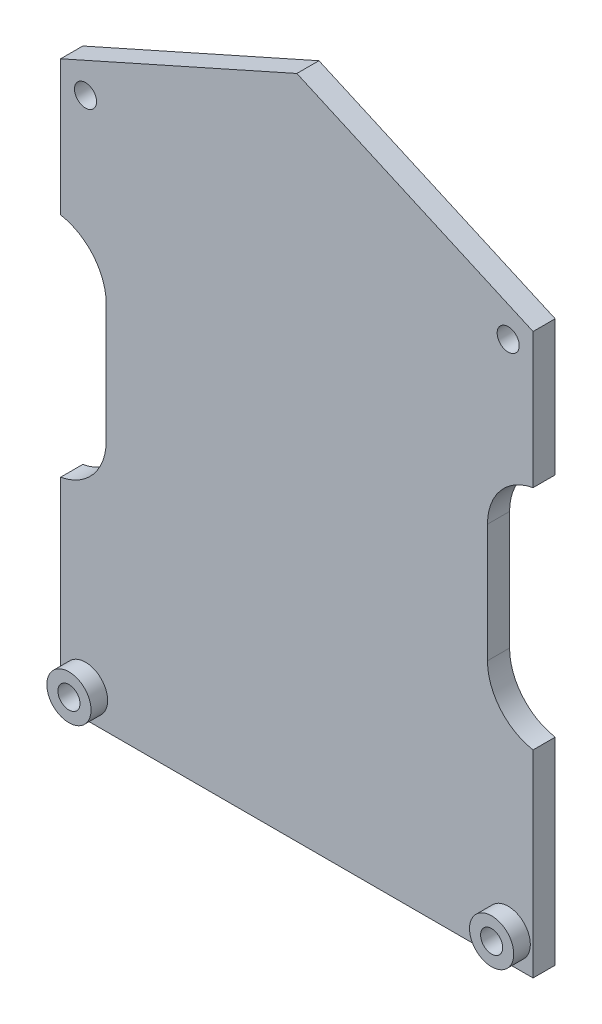
ISO-10303-21;
HEADER;
FILE_DESCRIPTION(('STEP AP214'),'2;1');
FILE_NAME('part.step','',(''),(''),'','','');
FILE_SCHEMA(('AUTOMOTIVE_DESIGN { 1 0 10303 214 1 1 1 1 }'));
ENDSEC;
DATA;
#1=APPLICATION_CONTEXT('core data for automotive mechanical design processes');
#2=APPLICATION_PROTOCOL_DEFINITION('international standard','automotive_design',2000,#1);
#3=PRODUCT_CONTEXT('',#1,'mechanical');
#4=PRODUCT('Part','Part','',(#3));
#5=PRODUCT_RELATED_PRODUCT_CATEGORY('part','',(#4));
#6=PRODUCT_DEFINITION_FORMATION('','',#4);
#7=PRODUCT_DEFINITION_CONTEXT('part definition',#1,'design');
#8=PRODUCT_DEFINITION('design','',#6,#7);
#9=PRODUCT_DEFINITION_SHAPE('','',#8);
#10=(LENGTH_UNIT() NAMED_UNIT(*) SI_UNIT(.MILLI.,.METRE.));
#11=(NAMED_UNIT(*) PLANE_ANGLE_UNIT() SI_UNIT($,.RADIAN.));
#12=(NAMED_UNIT(*) SI_UNIT($,.STERADIAN.) SOLID_ANGLE_UNIT());
#13=UNCERTAINTY_MEASURE_WITH_UNIT(LENGTH_MEASURE(1.E-05),#10,'distance_accuracy_value','');
#14=(GEOMETRIC_REPRESENTATION_CONTEXT(3) GLOBAL_UNCERTAINTY_ASSIGNED_CONTEXT((#13)) GLOBAL_UNIT_ASSIGNED_CONTEXT((#10,
#11,#12)) REPRESENTATION_CONTEXT('',''));
#15=CARTESIAN_POINT('',(0.,0.,0.));
#16=DIRECTION('',(0.,0.,1.));
#17=DIRECTION('',(1.,0.,0.));
#18=AXIS2_PLACEMENT_3D('',#15,#16,#17);
#19=CARTESIAN_POINT('',(0.,0.,4.));
#20=DIRECTION('',(0.,0.,-1.));
#21=DIRECTION('',(-1.,0.,0.));
#22=AXIS2_PLACEMENT_3D('',#19,#20,#21);
#23=PLANE('',#22);
#24=CARTESIAN_POINT('',(38.25,-87.85,4.));
#25=DIRECTION('',(0.,0.,-1.));
#26=DIRECTION('',(-1.,0.,0.));
#27=AXIS2_PLACEMENT_3D('',#24,#25,#26);
#28=CIRCLE('',#27,4.);
#29=CARTESIAN_POINT('',(34.25,-87.85,4.));
#30=VERTEX_POINT('',#29);
#31=EDGE_CURVE('E41',#30,#30,#28,.F.);
#32=ORIENTED_EDGE('',*,*,#31,.F.);
#33=EDGE_LOOP('',(#32));
#34=FACE_BOUND('',#33,.T.);
#35=DIRECTION('',(-0.913250682606187,-0.407398074025065,0.));
#36=VECTOR('',#35,1.);
#37=CARTESIAN_POINT('',(-42.75,8.48208122180861,4.));
#38=LINE('',#37,#36);
#39=CARTESIAN_POINT('',(0.,27.5527131920688,4.));
#40=VERTEX_POINT('',#39);
#41=CARTESIAN_POINT('',(-42.75,8.48208122180861,4.));
#42=VERTEX_POINT('',#41);
#43=EDGE_CURVE('E139',#40,#42,#38,.T.);
#44=ORIENTED_EDGE('',*,*,#43,.T.);
#45=DIRECTION('',(0.,-1.,0.));
#46=VECTOR('',#45,1.);
#47=CARTESIAN_POINT('',(-42.75,8.48208122180861,4.));
#48=LINE('',#47,#46);
#49=CARTESIAN_POINT('',(-42.75,-16.,4.));
#50=VERTEX_POINT('',#49);
#51=EDGE_CURVE('E129',#42,#50,#48,.T.);
#52=ORIENTED_EDGE('',*,*,#51,.T.);
#53=CARTESIAN_POINT('',(-44.5,-25.8456843337576,4.));
#54=DIRECTION('',(0.,0.,-1.));
#55=DIRECTION('',(-1.,0.,0.));
#56=AXIS2_PLACEMENT_3D('',#53,#54,#55);
#57=CIRCLE('',#56,10.);
#58=CARTESIAN_POINT('',(-34.5,-25.8456843337576,4.));
#59=VERTEX_POINT('',#58);
#60=EDGE_CURVE('E55',#50,#59,#57,.T.);
#61=ORIENTED_EDGE('',*,*,#60,.T.);
#62=DIRECTION('',(0.,-1.,0.));
#63=VECTOR('',#62,1.);
#64=CARTESIAN_POINT('',(-34.5,-16.,4.));
#65=LINE('',#64,#63);
#66=CARTESIAN_POINT('',(-34.5,-47.2543156662424,4.));
#67=VERTEX_POINT('',#66);
#68=EDGE_CURVE('E138',#59,#67,#65,.T.);
#69=ORIENTED_EDGE('',*,*,#68,.T.);
#70=CARTESIAN_POINT('',(-44.5,-47.2543156662424,4.));
#71=DIRECTION('',(0.,0.,-1.));
#72=DIRECTION('',(-1.,0.,0.));
#73=AXIS2_PLACEMENT_3D('',#70,#71,#72);
#74=CIRCLE('',#73,10.);
#75=CARTESIAN_POINT('',(-42.75,-57.1,4.));
#76=VERTEX_POINT('',#75);
#77=EDGE_CURVE('E177',#67,#76,#74,.T.);
#78=ORIENTED_EDGE('',*,*,#77,.T.);
#79=DIRECTION('',(0.,-1.,0.));
#80=VECTOR('',#79,1.);
#81=CARTESIAN_POINT('',(-42.75,-57.1,4.));
#82=LINE('',#81,#80);
#83=CARTESIAN_POINT('',(-42.75,-92.85,4.));
#84=VERTEX_POINT('',#83);
#85=EDGE_CURVE('E251',#76,#84,#82,.T.);
#86=ORIENTED_EDGE('',*,*,#85,.T.);
#87=DIRECTION('',(1.,0.,0.));
#88=VECTOR('',#87,1.);
#89=CARTESIAN_POINT('',(-42.75,-92.85,4.));
#90=LINE('',#89,#88);
#91=CARTESIAN_POINT('',(42.75,-92.85,4.));
#92=VERTEX_POINT('',#91);
#93=EDGE_CURVE('E257',#84,#92,#90,.T.);
#94=ORIENTED_EDGE('',*,*,#93,.T.);
#95=DIRECTION('',(0.,1.,0.));
#96=VECTOR('',#95,1.);
#97=CARTESIAN_POINT('',(42.75,-57.1,4.));
#98=LINE('',#97,#96);
#99=CARTESIAN_POINT('',(42.75,-57.1,4.));
#100=VERTEX_POINT('',#99);
#101=EDGE_CURVE('E259',#92,#100,#98,.T.);
#102=ORIENTED_EDGE('',*,*,#101,.T.);
#103=CARTESIAN_POINT('',(44.5,-47.2543156662424,4.));
#104=DIRECTION('',(0.,0.,-1.));
#105=DIRECTION('',(-1.,0.,0.));
#106=AXIS2_PLACEMENT_3D('',#103,#104,#105);
#107=CIRCLE('',#106,10.);
#108=CARTESIAN_POINT('',(34.5,-47.2543156662424,4.));
#109=VERTEX_POINT('',#108);
#110=EDGE_CURVE('E169',#100,#109,#107,.T.);
#111=ORIENTED_EDGE('',*,*,#110,.T.);
#112=DIRECTION('',(0.,1.,0.));
#113=VECTOR('',#112,1.);
#114=CARTESIAN_POINT('',(34.5,-16.,4.));
#115=LINE('',#114,#113);
#116=CARTESIAN_POINT('',(34.5,-25.8456843337576,4.));
#117=VERTEX_POINT('',#116);
#118=EDGE_CURVE('E264',#109,#117,#115,.T.);
#119=ORIENTED_EDGE('',*,*,#118,.T.);
#120=CARTESIAN_POINT('',(44.5,-25.8456843337576,4.));
#121=DIRECTION('',(0.,0.,-1.));
#122=DIRECTION('',(-1.,0.,0.));
#123=AXIS2_PLACEMENT_3D('',#120,#121,#122);
#124=CIRCLE('',#123,10.);
#125=CARTESIAN_POINT('',(42.75,-16.,4.));
#126=VERTEX_POINT('',#125);
#127=EDGE_CURVE('E173',#117,#126,#124,.T.);
#128=ORIENTED_EDGE('',*,*,#127,.T.);
#129=DIRECTION('',(0.,1.,0.));
#130=VECTOR('',#129,1.);
#131=CARTESIAN_POINT('',(42.75,8.48208122180861,4.));
#132=LINE('',#131,#130);
#133=CARTESIAN_POINT('',(42.75,8.48208122180861,4.));
#134=VERTEX_POINT('',#133);
#135=EDGE_CURVE('E267',#126,#134,#132,.T.);
#136=ORIENTED_EDGE('',*,*,#135,.T.);
#137=DIRECTION('',(-0.913250682606188,0.407398074025065,0.));
#138=VECTOR('',#137,1.);
#139=CARTESIAN_POINT('',(42.75,8.48208122180861,4.));
#140=LINE('',#139,#138);
#141=EDGE_CURVE('E144',#134,#40,#140,.T.);
#142=ORIENTED_EDGE('',*,*,#141,.T.);
#143=EDGE_LOOP('',(#44,#52,#61,#69,#78,#86,#94,#102,#111,#119,#128,#136,#142));
#144=FACE_BOUND('',#143,.T.);
#145=CARTESIAN_POINT('',(-38.25,4.99999999999999,4.));
#146=DIRECTION('',(0.,0.,1.));
#147=DIRECTION('',(1.,0.,0.));
#148=AXIS2_PLACEMENT_3D('',#145,#146,#147);
#149=CIRCLE('',#148,2.);
#150=CARTESIAN_POINT('',(-36.25,4.99999999999999,4.));
#151=VERTEX_POINT('',#150);
#152=EDGE_CURVE('E344',#151,#151,#149,.T.);
#153=ORIENTED_EDGE('',*,*,#152,.F.);
#154=EDGE_LOOP('',(#153));
#155=FACE_BOUND('',#154,.T.);
#156=CARTESIAN_POINT('',(38.25,4.99999999999999,4.));
#157=DIRECTION('',(0.,0.,1.));
#158=DIRECTION('',(-1.,0.,0.));
#159=AXIS2_PLACEMENT_3D('',#156,#157,#158);
#160=CIRCLE('',#159,2.);
#161=CARTESIAN_POINT('',(36.25,4.99999999999999,4.));
#162=VERTEX_POINT('',#161);
#163=EDGE_CURVE('E335',#162,#162,#160,.T.);
#164=ORIENTED_EDGE('',*,*,#163,.F.);
#165=EDGE_LOOP('',(#164));
#166=FACE_BOUND('',#165,.T.);
#167=CARTESIAN_POINT('',(-38.25,-87.85,4.));
#168=DIRECTION('',(0.,0.,-1.));
#169=DIRECTION('',(-1.,0.,0.));
#170=AXIS2_PLACEMENT_3D('',#167,#168,#169);
#171=CIRCLE('',#170,4.);
#172=CARTESIAN_POINT('',(-42.25,-87.85,4.));
#173=VERTEX_POINT('',#172);
#174=EDGE_CURVE('E11',#173,#173,#171,.F.);
#175=ORIENTED_EDGE('',*,*,#174,.F.);
#176=EDGE_LOOP('',(#175));
#177=FACE_BOUND('',#176,.T.);
#178=ADVANCED_FACE('F33',(#34,#144,#155,#166,#177),#23,.F.);
#179=CARTESIAN_POINT('',(0.,0.,0.));
#180=DIRECTION('',(0.,0.,-1.));
#181=DIRECTION('',(-1.,0.,0.));
#182=AXIS2_PLACEMENT_3D('',#179,#180,#181);
#183=PLANE('',#182);
#184=CARTESIAN_POINT('',(38.25,4.99999999999999,0.));
#185=DIRECTION('',(0.,0.,1.));
#186=DIRECTION('',(-1.,0.,0.));
#187=AXIS2_PLACEMENT_3D('',#184,#185,#186);
#188=CIRCLE('',#187,2.);
#189=CARTESIAN_POINT('',(36.25,4.99999999999999,0.));
#190=VERTEX_POINT('',#189);
#191=EDGE_CURVE('E331',#190,#190,#188,.T.);
#192=ORIENTED_EDGE('',*,*,#191,.T.);
#193=EDGE_LOOP('',(#192));
#194=FACE_BOUND('',#193,.T.);
#195=CARTESIAN_POINT('',(38.25,-87.85,0.));
#196=DIRECTION('',(0.,0.,1.));
#197=DIRECTION('',(-1.,0.,0.));
#198=AXIS2_PLACEMENT_3D('',#195,#196,#197);
#199=CIRCLE('',#198,1.99999999999999);
#200=CARTESIAN_POINT('',(36.25,-87.85,0.));
#201=VERTEX_POINT('',#200);
#202=EDGE_CURVE('E273',#201,#201,#199,.T.);
#203=ORIENTED_EDGE('',*,*,#202,.T.);
#204=EDGE_LOOP('',(#203));
#205=FACE_BOUND('',#204,.T.);
#206=DIRECTION('',(-0.913250682606187,-0.407398074025065,0.));
#207=VECTOR('',#206,1.);
#208=CARTESIAN_POINT('',(-42.75,8.48208122180861,0.));
#209=LINE('',#208,#207);
#210=CARTESIAN_POINT('',(0.,27.5527131920688,0.));
#211=VERTEX_POINT('',#210);
#212=CARTESIAN_POINT('',(-42.75,8.48208122180861,0.));
#213=VERTEX_POINT('',#212);
#214=EDGE_CURVE('E152',#211,#213,#209,.T.);
#215=ORIENTED_EDGE('',*,*,#214,.F.);
#216=DIRECTION('',(-0.913250682606188,0.407398074025065,0.));
#217=VECTOR('',#216,1.);
#218=CARTESIAN_POINT('',(42.75,8.48208122180861,0.));
#219=LINE('',#218,#217);
#220=CARTESIAN_POINT('',(42.75,8.48208122180861,0.));
#221=VERTEX_POINT('',#220);
#222=EDGE_CURVE('E148',#221,#211,#219,.T.);
#223=ORIENTED_EDGE('',*,*,#222,.F.);
#224=DIRECTION('',(0.,1.,0.));
#225=VECTOR('',#224,1.);
#226=CARTESIAN_POINT('',(42.75,8.48208122180861,0.));
#227=LINE('',#226,#225);
#228=CARTESIAN_POINT('',(42.75,-16.,0.));
#229=VERTEX_POINT('',#228);
#230=EDGE_CURVE('E287',#229,#221,#227,.T.);
#231=ORIENTED_EDGE('',*,*,#230,.F.);
#232=CARTESIAN_POINT('',(44.5,-25.8456843337576,0.));
#233=DIRECTION('',(0.,0.,-1.));
#234=DIRECTION('',(-1.,0.,0.));
#235=AXIS2_PLACEMENT_3D('',#232,#233,#234);
#236=CIRCLE('',#235,10.);
#237=CARTESIAN_POINT('',(34.5,-25.8456843337576,0.));
#238=VERTEX_POINT('',#237);
#239=EDGE_CURVE('E171',#229,#238,#236,.F.);
#240=ORIENTED_EDGE('',*,*,#239,.T.);
#241=DIRECTION('',(0.,1.,0.));
#242=VECTOR('',#241,1.);
#243=CARTESIAN_POINT('',(34.5,-16.,0.));
#244=LINE('',#243,#242);
#245=CARTESIAN_POINT('',(34.5,-47.2543156662424,0.));
#246=VERTEX_POINT('',#245);
#247=EDGE_CURVE('E284',#246,#238,#244,.T.);
#248=ORIENTED_EDGE('',*,*,#247,.F.);
#249=CARTESIAN_POINT('',(44.5,-47.2543156662424,0.));
#250=DIRECTION('',(0.,0.,-1.));
#251=DIRECTION('',(-1.,0.,0.));
#252=AXIS2_PLACEMENT_3D('',#249,#250,#251);
#253=CIRCLE('',#252,10.);
#254=CARTESIAN_POINT('',(42.75,-57.1,0.));
#255=VERTEX_POINT('',#254);
#256=EDGE_CURVE('E167',#246,#255,#253,.F.);
#257=ORIENTED_EDGE('',*,*,#256,.T.);
#258=DIRECTION('',(0.,1.,0.));
#259=VECTOR('',#258,1.);
#260=CARTESIAN_POINT('',(42.75,-57.1,0.));
#261=LINE('',#260,#259);
#262=CARTESIAN_POINT('',(42.75,-92.85,0.));
#263=VERTEX_POINT('',#262);
#264=EDGE_CURVE('E281',#263,#255,#261,.T.);
#265=ORIENTED_EDGE('',*,*,#264,.F.);
#266=DIRECTION('',(1.,0.,0.));
#267=VECTOR('',#266,1.);
#268=CARTESIAN_POINT('',(-42.75,-92.85,0.));
#269=LINE('',#268,#267);
#270=CARTESIAN_POINT('',(-42.75,-92.85,0.));
#271=VERTEX_POINT('',#270);
#272=EDGE_CURVE('E279',#271,#263,#269,.T.);
#273=ORIENTED_EDGE('',*,*,#272,.F.);
#274=DIRECTION('',(0.,-1.,0.));
#275=VECTOR('',#274,1.);
#276=CARTESIAN_POINT('',(-42.75,-57.1,0.));
#277=LINE('',#276,#275);
#278=CARTESIAN_POINT('',(-42.75,-57.1,0.));
#279=VERTEX_POINT('',#278);
#280=EDGE_CURVE('E277',#279,#271,#277,.T.);
#281=ORIENTED_EDGE('',*,*,#280,.F.);
#282=CARTESIAN_POINT('',(-44.5,-47.2543156662424,0.));
#283=DIRECTION('',(0.,0.,-1.));
#284=DIRECTION('',(-1.,0.,0.));
#285=AXIS2_PLACEMENT_3D('',#282,#283,#284);
#286=CIRCLE('',#285,10.);
#287=CARTESIAN_POINT('',(-34.5,-47.2543156662424,0.));
#288=VERTEX_POINT('',#287);
#289=EDGE_CURVE('E175',#279,#288,#286,.F.);
#290=ORIENTED_EDGE('',*,*,#289,.T.);
#291=DIRECTION('',(0.,-1.,0.));
#292=VECTOR('',#291,1.);
#293=CARTESIAN_POINT('',(-34.5,-16.,0.));
#294=LINE('',#293,#292);
#295=CARTESIAN_POINT('',(-34.5,-25.8456843337576,0.));
#296=VERTEX_POINT('',#295);
#297=EDGE_CURVE('E275',#296,#288,#294,.T.);
#298=ORIENTED_EDGE('',*,*,#297,.F.);
#299=CARTESIAN_POINT('',(-44.5,-25.8456843337576,0.));
#300=DIRECTION('',(0.,0.,-1.));
#301=DIRECTION('',(-1.,0.,0.));
#302=AXIS2_PLACEMENT_3D('',#299,#300,#301);
#303=CIRCLE('',#302,10.);
#304=CARTESIAN_POINT('',(-42.75,-16.,0.));
#305=VERTEX_POINT('',#304);
#306=EDGE_CURVE('E179',#296,#305,#303,.F.);
#307=ORIENTED_EDGE('',*,*,#306,.T.);
#308=DIRECTION('',(0.,-1.,0.));
#309=VECTOR('',#308,1.);
#310=CARTESIAN_POINT('',(-42.75,8.48208122180861,0.));
#311=LINE('',#310,#309);
#312=EDGE_CURVE('E272',#213,#305,#311,.T.);
#313=ORIENTED_EDGE('',*,*,#312,.F.);
#314=EDGE_LOOP('',(#215,#223,#231,#240,#248,#257,#265,#273,#281,#290,#298,#307,#313));
#315=FACE_BOUND('',#314,.T.);
#316=CARTESIAN_POINT('',(-38.25,4.99999999999999,0.));
#317=DIRECTION('',(0.,0.,1.));
#318=DIRECTION('',(1.,0.,0.));
#319=AXIS2_PLACEMENT_3D('',#316,#317,#318);
#320=CIRCLE('',#319,2.);
#321=CARTESIAN_POINT('',(-36.25,4.99999999999999,0.));
#322=VERTEX_POINT('',#321);
#323=EDGE_CURVE('E326',#322,#322,#320,.T.);
#324=ORIENTED_EDGE('',*,*,#323,.T.);
#325=EDGE_LOOP('',(#324));
#326=FACE_BOUND('',#325,.T.);
#327=CARTESIAN_POINT('',(-38.25,-87.85,0.));
#328=DIRECTION('',(0.,0.,1.));
#329=DIRECTION('',(1.,0.,0.));
#330=AXIS2_PLACEMENT_3D('',#327,#328,#329);
#331=CIRCLE('',#330,1.99999999999999);
#332=CARTESIAN_POINT('',(-36.25,-87.85,0.));
#333=VERTEX_POINT('',#332);
#334=EDGE_CURVE('E329',#333,#333,#331,.T.);
#335=ORIENTED_EDGE('',*,*,#334,.T.);
#336=EDGE_LOOP('',(#335));
#337=FACE_BOUND('',#336,.T.);
#338=ADVANCED_FACE('F187',(#194,#205,#315,#326,#337),#183,.T.);
#339=CARTESIAN_POINT('',(-42.75,8.48208122180861,4.));
#340=DIRECTION('',(0.407398074025065,-0.913250682606188,0.));
#341=DIRECTION('',(0.913250682606188,0.407398074025065,0.));
#342=AXIS2_PLACEMENT_3D('',#339,#340,#341);
#343=PLANE('',#342);
#344=ORIENTED_EDGE('',*,*,#214,.T.);
#345=DIRECTION('',(0.,0.,-1.));
#346=VECTOR('',#345,1.);
#347=CARTESIAN_POINT('',(-42.75,8.48208122180861,4.));
#348=LINE('',#347,#346);
#349=EDGE_CURVE('E134',#42,#213,#348,.T.);
#350=ORIENTED_EDGE('',*,*,#349,.F.);
#351=ORIENTED_EDGE('',*,*,#43,.F.);
#352=DIRECTION('',(0.,0.,-1.));
#353=VECTOR('',#352,1.);
#354=CARTESIAN_POINT('',(0.,27.5527131920688,4.));
#355=LINE('',#354,#353);
#356=EDGE_CURVE('E270',#40,#211,#355,.T.);
#357=ORIENTED_EDGE('',*,*,#356,.T.);
#358=EDGE_LOOP('',(#344,#350,#351,#357));
#359=FACE_BOUND('',#358,.T.);
#360=ADVANCED_FACE('F150',(#359),#343,.F.);
#361=CARTESIAN_POINT('',(-42.75,8.48208122180861,4.));
#362=DIRECTION('',(1.,0.,0.));
#363=DIRECTION('',(0.,0.,-1.));
#364=AXIS2_PLACEMENT_3D('',#361,#362,#363);
#365=PLANE('',#364);
#366=ORIENTED_EDGE('',*,*,#312,.T.);
#367=DIRECTION('',(0.,0.,-1.));
#368=VECTOR('',#367,1.);
#369=CARTESIAN_POINT('',(-42.75,-16.,4.));
#370=LINE('',#369,#368);
#371=EDGE_CURVE('E137',#50,#305,#370,.T.);
#372=ORIENTED_EDGE('',*,*,#371,.F.);
#373=ORIENTED_EDGE('',*,*,#51,.F.);
#374=ORIENTED_EDGE('',*,*,#349,.T.);
#375=EDGE_LOOP('',(#366,#372,#373,#374));
#376=FACE_BOUND('',#375,.T.);
#377=ADVANCED_FACE('F132',(#376),#365,.F.);
#378=CARTESIAN_POINT('',(-34.5,-16.,4.));
#379=DIRECTION('',(1.,0.,0.));
#380=DIRECTION('',(0.,0.,-1.));
#381=AXIS2_PLACEMENT_3D('',#378,#379,#380);
#382=PLANE('',#381);
#383=ORIENTED_EDGE('',*,*,#297,.T.);
#384=DIRECTION('',(0.,0.,1.));
#385=VECTOR('',#384,1.);
#386=CARTESIAN_POINT('',(-34.5,-47.2543156662424,4.));
#387=LINE('',#386,#385);
#388=EDGE_CURVE('E48',#288,#67,#387,.T.);
#389=ORIENTED_EDGE('',*,*,#388,.T.);
#390=ORIENTED_EDGE('',*,*,#68,.F.);
#391=DIRECTION('',(0.,0.,-1.));
#392=VECTOR('',#391,1.);
#393=CARTESIAN_POINT('',(-34.5,-25.8456843337576,4.));
#394=LINE('',#393,#392);
#395=EDGE_CURVE('E163',#59,#296,#394,.T.);
#396=ORIENTED_EDGE('',*,*,#395,.T.);
#397=EDGE_LOOP('',(#383,#389,#390,#396));
#398=FACE_BOUND('',#397,.T.);
#399=ADVANCED_FACE('F223',(#398),#382,.F.);
#400=CARTESIAN_POINT('',(-42.75,-57.1,4.));
#401=DIRECTION('',(1.,0.,0.));
#402=DIRECTION('',(0.,0.,-1.));
#403=AXIS2_PLACEMENT_3D('',#400,#401,#402);
#404=PLANE('',#403);
#405=ORIENTED_EDGE('',*,*,#280,.T.);
#406=DIRECTION('',(0.,0.,-1.));
#407=VECTOR('',#406,1.);
#408=CARTESIAN_POINT('',(-42.75,-92.85,4.));
#409=LINE('',#408,#407);
#410=EDGE_CURVE('E255',#84,#271,#409,.T.);
#411=ORIENTED_EDGE('',*,*,#410,.F.);
#412=ORIENTED_EDGE('',*,*,#85,.F.);
#413=DIRECTION('',(0.,0.,-1.));
#414=VECTOR('',#413,1.);
#415=CARTESIAN_POINT('',(-42.75,-57.1,4.));
#416=LINE('',#415,#414);
#417=EDGE_CURVE('E157',#76,#279,#416,.T.);
#418=ORIENTED_EDGE('',*,*,#417,.T.);
#419=EDGE_LOOP('',(#405,#411,#412,#418));
#420=FACE_BOUND('',#419,.T.);
#421=ADVANCED_FACE('F219',(#420),#404,.F.);
#422=CARTESIAN_POINT('',(-42.75,-92.85,4.));
#423=DIRECTION('',(0.,1.,0.));
#424=DIRECTION('',(0.,0.,1.));
#425=AXIS2_PLACEMENT_3D('',#422,#423,#424);
#426=PLANE('',#425);
#427=ORIENTED_EDGE('',*,*,#272,.T.);
#428=DIRECTION('',(0.,0.,-1.));
#429=VECTOR('',#428,1.);
#430=CARTESIAN_POINT('',(42.75,-92.85,4.));
#431=LINE('',#430,#429);
#432=EDGE_CURVE('E300',#92,#263,#431,.T.);
#433=ORIENTED_EDGE('',*,*,#432,.F.);
#434=ORIENTED_EDGE('',*,*,#93,.F.);
#435=ORIENTED_EDGE('',*,*,#410,.T.);
#436=EDGE_LOOP('',(#427,#433,#434,#435));
#437=FACE_BOUND('',#436,.T.);
#438=ADVANCED_FACE('F215',(#437),#426,.F.);
#439=CARTESIAN_POINT('',(42.75,-57.1,4.));
#440=DIRECTION('',(-1.,0.,0.));
#441=DIRECTION('',(0.,0.,1.));
#442=AXIS2_PLACEMENT_3D('',#439,#440,#441);
#443=PLANE('',#442);
#444=ORIENTED_EDGE('',*,*,#264,.T.);
#445=DIRECTION('',(0.,0.,-1.));
#446=VECTOR('',#445,1.);
#447=CARTESIAN_POINT('',(42.75,-57.1,4.));
#448=LINE('',#447,#446);
#449=EDGE_CURVE('E297',#100,#255,#448,.T.);
#450=ORIENTED_EDGE('',*,*,#449,.F.);
#451=ORIENTED_EDGE('',*,*,#101,.F.);
#452=ORIENTED_EDGE('',*,*,#432,.T.);
#453=EDGE_LOOP('',(#444,#450,#451,#452));
#454=FACE_BOUND('',#453,.T.);
#455=ADVANCED_FACE('F211',(#454),#443,.F.);
#456=CARTESIAN_POINT('',(34.5,-16.,4.));
#457=DIRECTION('',(-1.,0.,0.));
#458=DIRECTION('',(0.,0.,1.));
#459=AXIS2_PLACEMENT_3D('',#456,#457,#458);
#460=PLANE('',#459);
#461=ORIENTED_EDGE('',*,*,#118,.F.);
#462=DIRECTION('',(0.,0.,-1.));
#463=VECTOR('',#462,1.);
#464=CARTESIAN_POINT('',(34.5,-47.2543156662424,4.));
#465=LINE('',#464,#463);
#466=EDGE_CURVE('E155',#109,#246,#465,.T.);
#467=ORIENTED_EDGE('',*,*,#466,.T.);
#468=ORIENTED_EDGE('',*,*,#247,.T.);
#469=DIRECTION('',(0.,0.,1.));
#470=VECTOR('',#469,1.);
#471=CARTESIAN_POINT('',(34.5,-25.8456843337576,4.));
#472=LINE('',#471,#470);
#473=EDGE_CURVE('E153',#238,#117,#472,.T.);
#474=ORIENTED_EDGE('',*,*,#473,.T.);
#475=EDGE_LOOP('',(#461,#467,#468,#474));
#476=FACE_BOUND('',#475,.T.);
#477=ADVANCED_FACE('F207',(#476),#460,.F.);
#478=CARTESIAN_POINT('',(42.75,8.48208122180861,4.));
#479=DIRECTION('',(-1.,0.,0.));
#480=DIRECTION('',(0.,0.,1.));
#481=AXIS2_PLACEMENT_3D('',#478,#479,#480);
#482=PLANE('',#481);
#483=ORIENTED_EDGE('',*,*,#230,.T.);
#484=DIRECTION('',(0.,0.,-1.));
#485=VECTOR('',#484,1.);
#486=CARTESIAN_POINT('',(42.75,8.48208122180861,4.));
#487=LINE('',#486,#485);
#488=EDGE_CURVE('E291',#134,#221,#487,.T.);
#489=ORIENTED_EDGE('',*,*,#488,.F.);
#490=ORIENTED_EDGE('',*,*,#135,.F.);
#491=DIRECTION('',(0.,0.,-1.));
#492=VECTOR('',#491,1.);
#493=CARTESIAN_POINT('',(42.75,-16.,4.));
#494=LINE('',#493,#492);
#495=EDGE_CURVE('E294',#126,#229,#494,.T.);
#496=ORIENTED_EDGE('',*,*,#495,.T.);
#497=EDGE_LOOP('',(#483,#489,#490,#496));
#498=FACE_BOUND('',#497,.T.);
#499=ADVANCED_FACE('F203',(#498),#482,.F.);
#500=CARTESIAN_POINT('',(42.75,8.48208122180861,4.));
#501=DIRECTION('',(-0.407398074025065,-0.913250682606188,0.));
#502=DIRECTION('',(0.913250682606188,-0.407398074025065,0.));
#503=AXIS2_PLACEMENT_3D('',#500,#501,#502);
#504=PLANE('',#503);
#505=ORIENTED_EDGE('',*,*,#222,.T.);
#506=ORIENTED_EDGE('',*,*,#356,.F.);
#507=ORIENTED_EDGE('',*,*,#141,.F.);
#508=ORIENTED_EDGE('',*,*,#488,.T.);
#509=EDGE_LOOP('',(#505,#506,#507,#508));
#510=FACE_BOUND('',#509,.T.);
#511=ADVANCED_FACE('F200',(#510),#504,.F.);
#512=CARTESIAN_POINT('',(38.25,-87.85,4.));
#513=DIRECTION('',(0.,0.,-1.));
#514=DIRECTION('',(-1.,0.,0.));
#515=AXIS2_PLACEMENT_3D('',#512,#513,#514);
#516=CYLINDRICAL_SURFACE('',#515,1.99999999999999);
#517=ORIENTED_EDGE('',*,*,#202,.F.);
#518=EDGE_LOOP('',(#517));
#519=FACE_BOUND('',#518,.T.);
#520=CARTESIAN_POINT('',(38.25,-87.85,7.));
#521=DIRECTION('',(0.,0.,1.));
#522=DIRECTION('',(1.,0.,0.));
#523=AXIS2_PLACEMENT_3D('',#520,#521,#522);
#524=CIRCLE('',#523,2.);
#525=CARTESIAN_POINT('',(40.25,-87.85,7.));
#526=VERTEX_POINT('',#525);
#527=EDGE_CURVE('E338',#526,#526,#524,.T.);
#528=ORIENTED_EDGE('',*,*,#527,.T.);
#529=EDGE_LOOP('',(#528));
#530=FACE_BOUND('',#529,.T.);
#531=ADVANCED_FACE('F197',(#519,#530),#516,.F.);
#532=CARTESIAN_POINT('',(-38.25,4.99999999999999,4.));
#533=DIRECTION('',(0.,0.,-1.));
#534=DIRECTION('',(-1.,0.,0.));
#535=AXIS2_PLACEMENT_3D('',#532,#533,#534);
#536=CYLINDRICAL_SURFACE('',#535,2.);
#537=ORIENTED_EDGE('',*,*,#152,.T.);
#538=EDGE_LOOP('',(#537));
#539=FACE_BOUND('',#538,.T.);
#540=ORIENTED_EDGE('',*,*,#323,.F.);
#541=EDGE_LOOP('',(#540));
#542=FACE_BOUND('',#541,.T.);
#543=ADVANCED_FACE('F354',(#539,#542),#536,.F.);
#544=CARTESIAN_POINT('',(38.25,4.99999999999999,4.));
#545=DIRECTION('',(0.,0.,-1.));
#546=DIRECTION('',(-1.,0.,0.));
#547=AXIS2_PLACEMENT_3D('',#544,#545,#546);
#548=CYLINDRICAL_SURFACE('',#547,2.);
#549=ORIENTED_EDGE('',*,*,#163,.T.);
#550=EDGE_LOOP('',(#549));
#551=FACE_BOUND('',#550,.T.);
#552=ORIENTED_EDGE('',*,*,#191,.F.);
#553=EDGE_LOOP('',(#552));
#554=FACE_BOUND('',#553,.T.);
#555=ADVANCED_FACE('F386',(#551,#554),#548,.F.);
#556=CARTESIAN_POINT('',(-38.25,-87.85,4.));
#557=DIRECTION('',(0.,0.,-1.));
#558=DIRECTION('',(-1.,0.,0.));
#559=AXIS2_PLACEMENT_3D('',#556,#557,#558);
#560=CYLINDRICAL_SURFACE('',#559,1.99999999999999);
#561=ORIENTED_EDGE('',*,*,#334,.F.);
#562=EDGE_LOOP('',(#561));
#563=FACE_BOUND('',#562,.T.);
#564=CARTESIAN_POINT('',(-38.25,-87.85,7.));
#565=DIRECTION('',(0.,0.,1.));
#566=DIRECTION('',(1.,0.,0.));
#567=AXIS2_PLACEMENT_3D('',#564,#565,#566);
#568=CIRCLE('',#567,2.);
#569=CARTESIAN_POINT('',(-36.25,-87.85,7.));
#570=VERTEX_POINT('',#569);
#571=EDGE_CURVE('E360',#570,#570,#568,.T.);
#572=ORIENTED_EDGE('',*,*,#571,.T.);
#573=EDGE_LOOP('',(#572));
#574=FACE_BOUND('',#573,.T.);
#575=ADVANCED_FACE('F235',(#563,#574),#560,.F.);
#576=CARTESIAN_POINT('',(44.5,-47.2543156662424,4.));
#577=DIRECTION('',(0.,0.,-1.));
#578=DIRECTION('',(-1.,0.,0.));
#579=AXIS2_PLACEMENT_3D('',#576,#577,#578);
#580=CYLINDRICAL_SURFACE('',#579,10.);
#581=ORIENTED_EDGE('',*,*,#110,.F.);
#582=ORIENTED_EDGE('',*,*,#449,.T.);
#583=ORIENTED_EDGE('',*,*,#256,.F.);
#584=ORIENTED_EDGE('',*,*,#466,.F.);
#585=EDGE_LOOP('',(#581,#582,#583,#584));
#586=FACE_BOUND('',#585,.T.);
#587=ADVANCED_FACE('F231',(#586),#580,.F.);
#588=CARTESIAN_POINT('',(44.5,-25.8456843337576,4.));
#589=DIRECTION('',(0.,0.,1.));
#590=DIRECTION('',(1.,0.,0.));
#591=AXIS2_PLACEMENT_3D('',#588,#589,#590);
#592=CYLINDRICAL_SURFACE('',#591,10.);
#593=ORIENTED_EDGE('',*,*,#127,.F.);
#594=ORIENTED_EDGE('',*,*,#473,.F.);
#595=ORIENTED_EDGE('',*,*,#239,.F.);
#596=ORIENTED_EDGE('',*,*,#495,.F.);
#597=EDGE_LOOP('',(#593,#594,#595,#596));
#598=FACE_BOUND('',#597,.T.);
#599=ADVANCED_FACE('F234',(#598),#592,.F.);
#600=CARTESIAN_POINT('',(-44.5,-47.2543156662424,4.));
#601=DIRECTION('',(0.,0.,1.));
#602=DIRECTION('',(1.,0.,0.));
#603=AXIS2_PLACEMENT_3D('',#600,#601,#602);
#604=CYLINDRICAL_SURFACE('',#603,10.);
#605=ORIENTED_EDGE('',*,*,#77,.F.);
#606=ORIENTED_EDGE('',*,*,#388,.F.);
#607=ORIENTED_EDGE('',*,*,#289,.F.);
#608=ORIENTED_EDGE('',*,*,#417,.F.);
#609=EDGE_LOOP('',(#605,#606,#607,#608));
#610=FACE_BOUND('',#609,.T.);
#611=ADVANCED_FACE('F238',(#610),#604,.F.);
#612=CARTESIAN_POINT('',(-44.5,-25.8456843337576,4.));
#613=DIRECTION('',(0.,0.,-1.));
#614=DIRECTION('',(-1.,0.,0.));
#615=AXIS2_PLACEMENT_3D('',#612,#613,#614);
#616=CYLINDRICAL_SURFACE('',#615,10.);
#617=ORIENTED_EDGE('',*,*,#60,.F.);
#618=ORIENTED_EDGE('',*,*,#371,.T.);
#619=ORIENTED_EDGE('',*,*,#306,.F.);
#620=ORIENTED_EDGE('',*,*,#395,.F.);
#621=EDGE_LOOP('',(#617,#618,#619,#620));
#622=FACE_BOUND('',#621,.T.);
#623=ADVANCED_FACE('F35',(#622),#616,.F.);
#624=CARTESIAN_POINT('',(38.25,-87.85,7.));
#625=DIRECTION('',(0.,0.,1.));
#626=DIRECTION('',(1.,0.,0.));
#627=AXIS2_PLACEMENT_3D('',#624,#625,#626);
#628=PLANE('',#627);
#629=CARTESIAN_POINT('',(38.25,-87.85,7.));
#630=DIRECTION('',(0.,0.,1.));
#631=DIRECTION('',(1.,0.,0.));
#632=AXIS2_PLACEMENT_3D('',#629,#630,#631);
#633=CIRCLE('',#632,4.);
#634=CARTESIAN_POINT('',(42.25,-87.85,7.));
#635=VERTEX_POINT('',#634);
#636=EDGE_CURVE('E332',#635,#635,#633,.T.);
#637=ORIENTED_EDGE('',*,*,#636,.T.);
#638=EDGE_LOOP('',(#637));
#639=FACE_BOUND('',#638,.T.);
#640=ORIENTED_EDGE('',*,*,#527,.F.);
#641=EDGE_LOOP('',(#640));
#642=FACE_BOUND('',#641,.T.);
#643=ADVANCED_FACE('F245',(#639,#642),#628,.T.);
#644=CARTESIAN_POINT('',(38.25,-87.85,7.));
#645=DIRECTION('',(0.,0.,-1.));
#646=DIRECTION('',(-1.,0.,0.));
#647=AXIS2_PLACEMENT_3D('',#644,#645,#646);
#648=CYLINDRICAL_SURFACE('',#647,4.);
#649=ORIENTED_EDGE('',*,*,#636,.F.);
#650=EDGE_LOOP('',(#649));
#651=FACE_BOUND('',#650,.T.);
#652=ORIENTED_EDGE('',*,*,#31,.T.);
#653=EDGE_LOOP('',(#652));
#654=FACE_BOUND('',#653,.T.);
#655=ADVANCED_FACE('F184',(#651,#654),#648,.T.);
#656=CARTESIAN_POINT('',(-38.25,-87.85,7.));
#657=DIRECTION('',(0.,0.,1.));
#658=DIRECTION('',(1.,0.,0.));
#659=AXIS2_PLACEMENT_3D('',#656,#657,#658);
#660=PLANE('',#659);
#661=CARTESIAN_POINT('',(-38.25,-87.85,7.));
#662=DIRECTION('',(0.,0.,1.));
#663=DIRECTION('',(1.,0.,0.));
#664=AXIS2_PLACEMENT_3D('',#661,#662,#663);
#665=CIRCLE('',#664,4.);
#666=CARTESIAN_POINT('',(-34.25,-87.85,7.));
#667=VERTEX_POINT('',#666);
#668=EDGE_CURVE('E358',#667,#667,#665,.T.);
#669=ORIENTED_EDGE('',*,*,#668,.T.);
#670=EDGE_LOOP('',(#669));
#671=FACE_BOUND('',#670,.T.);
#672=ORIENTED_EDGE('',*,*,#571,.F.);
#673=EDGE_LOOP('',(#672));
#674=FACE_BOUND('',#673,.T.);
#675=ADVANCED_FACE('F367',(#671,#674),#660,.T.);
#676=CARTESIAN_POINT('',(-38.25,-87.85,7.));
#677=DIRECTION('',(0.,0.,-1.));
#678=DIRECTION('',(-1.,0.,0.));
#679=AXIS2_PLACEMENT_3D('',#676,#677,#678);
#680=CYLINDRICAL_SURFACE('',#679,4.);
#681=ORIENTED_EDGE('',*,*,#668,.F.);
#682=EDGE_LOOP('',(#681));
#683=FACE_BOUND('',#682,.T.);
#684=ORIENTED_EDGE('',*,*,#174,.T.);
#685=EDGE_LOOP('',(#684));
#686=FACE_BOUND('',#685,.T.);
#687=ADVANCED_FACE('F369',(#683,#686),#680,.T.);
#688=CLOSED_SHELL('',(#178,#338,#360,#377,#399,#421,#438,#455,#477,#499,#511,#531,#543,#555,
#575,#587,#599,#611,#623,#643,#655,#675,#687));
#689=MANIFOLD_SOLID_BREP('B2',#688);
#690=ADVANCED_BREP_SHAPE_REPRESENTATION('',(#18,#689),#14);
#691=SHAPE_DEFINITION_REPRESENTATION(#9,#690);
ENDSEC;
END-ISO-10303-21;
